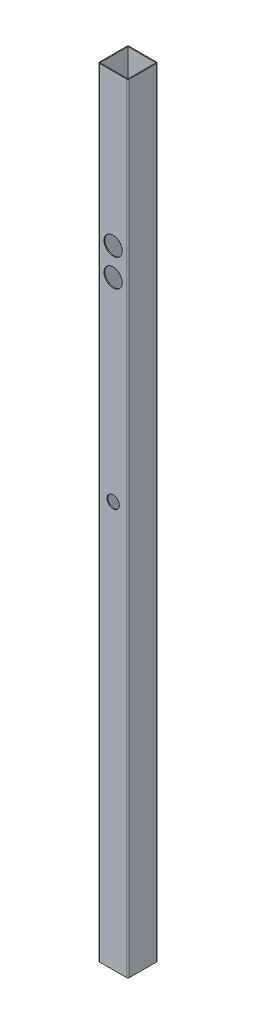
ISO-10303-21;
HEADER;
FILE_DESCRIPTION(('STEP AP214'),'2;1');
FILE_NAME('part.step','',(''),(''),'','','');
FILE_SCHEMA(('AUTOMOTIVE_DESIGN { 1 0 10303 214 1 1 1 1 }'));
ENDSEC;
DATA;
#1=APPLICATION_CONTEXT('core data for automotive mechanical design processes');
#2=APPLICATION_PROTOCOL_DEFINITION('international standard','automotive_design',2000,#1);
#3=PRODUCT_CONTEXT('',#1,'mechanical');
#4=PRODUCT('Part','Part','',(#3));
#5=PRODUCT_RELATED_PRODUCT_CATEGORY('part','',(#4));
#6=PRODUCT_DEFINITION_FORMATION('','',#4);
#7=PRODUCT_DEFINITION_CONTEXT('part definition',#1,'design');
#8=PRODUCT_DEFINITION('design','',#6,#7);
#9=PRODUCT_DEFINITION_SHAPE('','',#8);
#10=(LENGTH_UNIT() NAMED_UNIT(*) SI_UNIT(.MILLI.,.METRE.));
#11=(NAMED_UNIT(*) PLANE_ANGLE_UNIT() SI_UNIT($,.RADIAN.));
#12=(NAMED_UNIT(*) SI_UNIT($,.STERADIAN.) SOLID_ANGLE_UNIT());
#13=UNCERTAINTY_MEASURE_WITH_UNIT(LENGTH_MEASURE(1.E-05),#10,'distance_accuracy_value','');
#14=(GEOMETRIC_REPRESENTATION_CONTEXT(3) GLOBAL_UNCERTAINTY_ASSIGNED_CONTEXT((#13)) GLOBAL_UNIT_ASSIGNED_CONTEXT((#10,
#11,#12)) REPRESENTATION_CONTEXT('',''));
#15=CARTESIAN_POINT('',(0.,0.,0.));
#16=DIRECTION('',(0.,0.,1.));
#17=DIRECTION('',(1.,0.,0.));
#18=AXIS2_PLACEMENT_3D('',#15,#16,#17);
#19=CARTESIAN_POINT('',(0.,1700.,0.));
#20=DIRECTION('',(0.,1.,0.));
#21=DIRECTION('',(0.,0.,1.));
#22=AXIS2_PLACEMENT_3D('',#19,#20,#21);
#23=PLANE('',#22);
#24=DIRECTION('',(-1.,0.,0.));
#25=VECTOR('',#24,1.);
#26=CARTESIAN_POINT('',(-32.5,1700.,-32.5));
#27=LINE('',#26,#25);
#28=CARTESIAN_POINT('',(29.5,1700.,-32.5));
#29=VERTEX_POINT('',#28);
#30=CARTESIAN_POINT('',(-29.5,1700.,-32.5));
#31=VERTEX_POINT('',#30);
#32=EDGE_CURVE('E180',#29,#31,#27,.T.);
#33=ORIENTED_EDGE('',*,*,#32,.T.);
#34=CARTESIAN_POINT('',(-29.5,1700.,-29.5));
#35=DIRECTION('',(0.,1.,0.));
#36=DIRECTION('',(0.,0.,1.));
#37=AXIS2_PLACEMENT_3D('',#34,#35,#36);
#38=CIRCLE('',#37,3.);
#39=CARTESIAN_POINT('',(-32.5,1700.,-29.5));
#40=VERTEX_POINT('',#39);
#41=EDGE_CURVE('E222',#31,#40,#38,.T.);
#42=ORIENTED_EDGE('',*,*,#41,.T.);
#43=DIRECTION('',(0.,0.,1.));
#44=VECTOR('',#43,1.);
#45=CARTESIAN_POINT('',(-32.5,1700.,-32.5));
#46=LINE('',#45,#44);
#47=CARTESIAN_POINT('',(-32.5,1700.,29.5));
#48=VERTEX_POINT('',#47);
#49=EDGE_CURVE('E184',#40,#48,#46,.T.);
#50=ORIENTED_EDGE('',*,*,#49,.T.);
#51=CARTESIAN_POINT('',(-29.5,1700.,29.5));
#52=DIRECTION('',(0.,1.,0.));
#53=DIRECTION('',(0.,0.,1.));
#54=AXIS2_PLACEMENT_3D('',#51,#52,#53);
#55=CIRCLE('',#54,3.);
#56=CARTESIAN_POINT('',(-29.5,1700.,32.5));
#57=VERTEX_POINT('',#56);
#58=EDGE_CURVE('E63',#48,#57,#55,.T.);
#59=ORIENTED_EDGE('',*,*,#58,.T.);
#60=DIRECTION('',(1.,0.,0.));
#61=VECTOR('',#60,1.);
#62=CARTESIAN_POINT('',(-32.5,1700.,32.5));
#63=LINE('',#62,#61);
#64=CARTESIAN_POINT('',(29.5,1700.,32.5));
#65=VERTEX_POINT('',#64);
#66=EDGE_CURVE('E186',#57,#65,#63,.T.);
#67=ORIENTED_EDGE('',*,*,#66,.T.);
#68=CARTESIAN_POINT('',(29.5,1700.,29.5));
#69=DIRECTION('',(0.,1.,0.));
#70=DIRECTION('',(0.,0.,1.));
#71=AXIS2_PLACEMENT_3D('',#68,#69,#70);
#72=CIRCLE('',#71,3.);
#73=CARTESIAN_POINT('',(32.5,1700.,29.5));
#74=VERTEX_POINT('',#73);
#75=EDGE_CURVE('E219',#65,#74,#72,.T.);
#76=ORIENTED_EDGE('',*,*,#75,.T.);
#77=DIRECTION('',(0.,0.,-1.));
#78=VECTOR('',#77,1.);
#79=CARTESIAN_POINT('',(32.5,1700.,-32.5));
#80=LINE('',#79,#78);
#81=CARTESIAN_POINT('',(32.5,1700.,-29.5));
#82=VERTEX_POINT('',#81);
#83=EDGE_CURVE('E177',#74,#82,#80,.T.);
#84=ORIENTED_EDGE('',*,*,#83,.T.);
#85=CARTESIAN_POINT('',(29.5,1700.,-29.5));
#86=DIRECTION('',(0.,1.,0.));
#87=DIRECTION('',(0.,0.,1.));
#88=AXIS2_PLACEMENT_3D('',#85,#86,#87);
#89=CIRCLE('',#88,3.);
#90=EDGE_CURVE('E217',#82,#29,#89,.T.);
#91=ORIENTED_EDGE('',*,*,#90,.T.);
#92=EDGE_LOOP('',(#33,#42,#50,#59,#67,#76,#84,#91));
#93=FACE_BOUND('',#92,.T.);
#94=DIRECTION('',(1.,0.,0.));
#95=VECTOR('',#94,1.);
#96=CARTESIAN_POINT('',(-30.5,1700.,30.5));
#97=LINE('',#96,#95);
#98=CARTESIAN_POINT('',(-30.5,1700.,30.5));
#99=VERTEX_POINT('',#98);
#100=CARTESIAN_POINT('',(30.5,1700.,30.5));
#101=VERTEX_POINT('',#100);
#102=EDGE_CURVE('E143',#99,#101,#97,.T.);
#103=ORIENTED_EDGE('',*,*,#102,.F.);
#104=DIRECTION('',(0.,0.,1.));
#105=VECTOR('',#104,1.);
#106=CARTESIAN_POINT('',(-30.5,1700.,-30.5));
#107=LINE('',#106,#105);
#108=CARTESIAN_POINT('',(-30.5,1700.,-30.5));
#109=VERTEX_POINT('',#108);
#110=EDGE_CURVE('E133',#109,#99,#107,.T.);
#111=ORIENTED_EDGE('',*,*,#110,.F.);
#112=DIRECTION('',(-1.,0.,0.));
#113=VECTOR('',#112,1.);
#114=CARTESIAN_POINT('',(-30.5,1700.,-30.5));
#115=LINE('',#114,#113);
#116=CARTESIAN_POINT('',(30.5,1700.,-30.5));
#117=VERTEX_POINT('',#116);
#118=EDGE_CURVE('E158',#117,#109,#115,.T.);
#119=ORIENTED_EDGE('',*,*,#118,.F.);
#120=DIRECTION('',(0.,0.,-1.));
#121=VECTOR('',#120,1.);
#122=CARTESIAN_POINT('',(30.5,1700.,-30.5));
#123=LINE('',#122,#121);
#124=EDGE_CURVE('E156',#101,#117,#123,.T.);
#125=ORIENTED_EDGE('',*,*,#124,.F.);
#126=EDGE_LOOP('',(#103,#111,#119,#125));
#127=FACE_BOUND('',#126,.T.);
#128=ADVANCED_FACE('F39',(#93,#127),#23,.T.);
#129=CARTESIAN_POINT('',(0.,0.,0.));
#130=DIRECTION('',(0.,1.,0.));
#131=DIRECTION('',(0.,0.,1.));
#132=AXIS2_PLACEMENT_3D('',#129,#130,#131);
#133=PLANE('',#132);
#134=DIRECTION('',(0.,0.,1.));
#135=VECTOR('',#134,1.);
#136=CARTESIAN_POINT('',(-32.5,0.,-32.5));
#137=LINE('',#136,#135);
#138=CARTESIAN_POINT('',(-32.5,0.,-29.5));
#139=VERTEX_POINT('',#138);
#140=CARTESIAN_POINT('',(-32.5,0.,29.5));
#141=VERTEX_POINT('',#140);
#142=EDGE_CURVE('E194',#139,#141,#137,.T.);
#143=ORIENTED_EDGE('',*,*,#142,.F.);
#144=CARTESIAN_POINT('',(-29.5,0.,-29.5));
#145=DIRECTION('',(0.,1.,0.));
#146=DIRECTION('',(0.,0.,1.));
#147=AXIS2_PLACEMENT_3D('',#144,#145,#146);
#148=CIRCLE('',#147,3.);
#149=CARTESIAN_POINT('',(-29.5,0.,-32.5));
#150=VERTEX_POINT('',#149);
#151=EDGE_CURVE('E209',#139,#150,#148,.F.);
#152=ORIENTED_EDGE('',*,*,#151,.T.);
#153=DIRECTION('',(-1.,0.,0.));
#154=VECTOR('',#153,1.);
#155=CARTESIAN_POINT('',(-32.5,0.,-32.5));
#156=LINE('',#155,#154);
#157=CARTESIAN_POINT('',(29.5,0.,-32.5));
#158=VERTEX_POINT('',#157);
#159=EDGE_CURVE('E191',#158,#150,#156,.T.);
#160=ORIENTED_EDGE('',*,*,#159,.F.);
#161=CARTESIAN_POINT('',(29.5,0.,-29.5));
#162=DIRECTION('',(0.,1.,0.));
#163=DIRECTION('',(0.,0.,1.));
#164=AXIS2_PLACEMENT_3D('',#161,#162,#163);
#165=CIRCLE('',#164,3.);
#166=CARTESIAN_POINT('',(32.5,0.,-29.5));
#167=VERTEX_POINT('',#166);
#168=EDGE_CURVE('E203',#158,#167,#165,.F.);
#169=ORIENTED_EDGE('',*,*,#168,.T.);
#170=DIRECTION('',(0.,0.,-1.));
#171=VECTOR('',#170,1.);
#172=CARTESIAN_POINT('',(32.5,0.,-32.5));
#173=LINE('',#172,#171);
#174=CARTESIAN_POINT('',(32.5,0.,29.5));
#175=VERTEX_POINT('',#174);
#176=EDGE_CURVE('E151',#175,#167,#173,.T.);
#177=ORIENTED_EDGE('',*,*,#176,.F.);
#178=CARTESIAN_POINT('',(29.5,0.,29.5));
#179=DIRECTION('',(0.,1.,0.));
#180=DIRECTION('',(0.,0.,1.));
#181=AXIS2_PLACEMENT_3D('',#178,#179,#180);
#182=CIRCLE('',#181,3.);
#183=CARTESIAN_POINT('',(29.5,0.,32.5));
#184=VERTEX_POINT('',#183);
#185=EDGE_CURVE('E205',#175,#184,#182,.F.);
#186=ORIENTED_EDGE('',*,*,#185,.T.);
#187=DIRECTION('',(1.,0.,0.));
#188=VECTOR('',#187,1.);
#189=CARTESIAN_POINT('',(-32.5,0.,32.5));
#190=LINE('',#189,#188);
#191=CARTESIAN_POINT('',(-29.5,0.,32.5));
#192=VERTEX_POINT('',#191);
#193=EDGE_CURVE('E181',#192,#184,#190,.T.);
#194=ORIENTED_EDGE('',*,*,#193,.F.);
#195=CARTESIAN_POINT('',(-29.5,0.,29.5));
#196=DIRECTION('',(0.,1.,0.));
#197=DIRECTION('',(0.,0.,1.));
#198=AXIS2_PLACEMENT_3D('',#195,#196,#197);
#199=CIRCLE('',#198,3.);
#200=EDGE_CURVE('E207',#192,#141,#199,.F.);
#201=ORIENTED_EDGE('',*,*,#200,.T.);
#202=EDGE_LOOP('',(#143,#152,#160,#169,#177,#186,#194,#201));
#203=FACE_BOUND('',#202,.T.);
#204=DIRECTION('',(0.,0.,1.));
#205=VECTOR('',#204,1.);
#206=CARTESIAN_POINT('',(-30.5,0.,-30.5));
#207=LINE('',#206,#205);
#208=CARTESIAN_POINT('',(-30.5,0.,-30.5));
#209=VERTEX_POINT('',#208);
#210=CARTESIAN_POINT('',(-30.5,0.,30.5));
#211=VERTEX_POINT('',#210);
#212=EDGE_CURVE('E163',#209,#211,#207,.T.);
#213=ORIENTED_EDGE('',*,*,#212,.T.);
#214=DIRECTION('',(1.,0.,0.));
#215=VECTOR('',#214,1.);
#216=CARTESIAN_POINT('',(-30.5,0.,30.5));
#217=LINE('',#216,#215);
#218=CARTESIAN_POINT('',(30.5,0.,30.5));
#219=VERTEX_POINT('',#218);
#220=EDGE_CURVE('E150',#211,#219,#217,.T.);
#221=ORIENTED_EDGE('',*,*,#220,.T.);
#222=DIRECTION('',(0.,0.,-1.));
#223=VECTOR('',#222,1.);
#224=CARTESIAN_POINT('',(30.5,0.,-30.5));
#225=LINE('',#224,#223);
#226=CARTESIAN_POINT('',(30.5,0.,-30.5));
#227=VERTEX_POINT('',#226);
#228=EDGE_CURVE('E167',#219,#227,#225,.T.);
#229=ORIENTED_EDGE('',*,*,#228,.T.);
#230=DIRECTION('',(-1.,0.,0.));
#231=VECTOR('',#230,1.);
#232=CARTESIAN_POINT('',(-30.5,0.,-30.5));
#233=LINE('',#232,#231);
#234=EDGE_CURVE('E144',#227,#209,#233,.T.);
#235=ORIENTED_EDGE('',*,*,#234,.T.);
#236=EDGE_LOOP('',(#213,#221,#229,#235));
#237=FACE_BOUND('',#236,.T.);
#238=ADVANCED_FACE('F246',(#203,#237),#133,.F.);
#239=CARTESIAN_POINT('',(32.5,1700.,-32.5));
#240=DIRECTION('',(-1.,0.,0.));
#241=DIRECTION('',(0.,0.,1.));
#242=AXIS2_PLACEMENT_3D('',#239,#240,#241);
#243=PLANE('',#242);
#244=ORIENTED_EDGE('',*,*,#83,.F.);
#245=DIRECTION('',(0.,-1.,0.));
#246=VECTOR('',#245,1.);
#247=CARTESIAN_POINT('',(32.5,1700.,29.5));
#248=LINE('',#247,#246);
#249=EDGE_CURVE('E11',#74,#175,#248,.T.);
#250=ORIENTED_EDGE('',*,*,#249,.T.);
#251=ORIENTED_EDGE('',*,*,#176,.T.);
#252=DIRECTION('',(0.,-1.,0.));
#253=VECTOR('',#252,1.);
#254=CARTESIAN_POINT('',(32.5,1700.,-29.5));
#255=LINE('',#254,#253);
#256=EDGE_CURVE('E49',#167,#82,#255,.F.);
#257=ORIENTED_EDGE('',*,*,#256,.T.);
#258=EDGE_LOOP('',(#244,#250,#251,#257));
#259=FACE_BOUND('',#258,.T.);
#260=ADVANCED_FACE('F232',(#259),#243,.F.);
#261=CARTESIAN_POINT('',(-32.5,1700.,-32.5));
#262=DIRECTION('',(0.,0.,1.));
#263=DIRECTION('',(1.,0.,0.));
#264=AXIS2_PLACEMENT_3D('',#261,#262,#263);
#265=PLANE('',#264);
#266=CARTESIAN_POINT('',(0.,885.5,-32.5));
#267=DIRECTION('',(0.,0.,-1.));
#268=DIRECTION('',(-1.,0.,0.));
#269=AXIS2_PLACEMENT_3D('',#266,#267,#268);
#270=CIRCLE('',#269,13.5);
#271=CARTESIAN_POINT('',(-13.5,885.5,-32.5));
#272=VERTEX_POINT('',#271);
#273=EDGE_CURVE('E437',#272,#272,#270,.T.);
#274=ORIENTED_EDGE('',*,*,#273,.F.);
#275=EDGE_LOOP('',(#274));
#276=FACE_BOUND('',#275,.T.);
#277=CARTESIAN_POINT('',(-20.0000000000001,1280.,-32.5));
#278=DIRECTION('',(0.,0.,-1.));
#279=DIRECTION('',(1.,0.,0.));
#280=AXIS2_PLACEMENT_3D('',#277,#278,#279);
#281=CIRCLE('',#280,3.);
#282=CARTESIAN_POINT('',(-17.0000000000001,1280.,-32.5));
#283=VERTEX_POINT('',#282);
#284=EDGE_CURVE('E360',#283,#283,#281,.T.);
#285=ORIENTED_EDGE('',*,*,#284,.F.);
#286=EDGE_LOOP('',(#285));
#287=FACE_BOUND('',#286,.T.);
#288=CARTESIAN_POINT('',(0.,300.,-32.5));
#289=DIRECTION('',(0.,0.,-1.));
#290=DIRECTION('',(-1.,0.,0.));
#291=AXIS2_PLACEMENT_3D('',#288,#289,#290);
#292=CIRCLE('',#291,27.5);
#293=CARTESIAN_POINT('',(-27.5,300.,-32.5));
#294=VERTEX_POINT('',#293);
#295=EDGE_CURVE('E366',#294,#294,#292,.T.);
#296=ORIENTED_EDGE('',*,*,#295,.F.);
#297=EDGE_LOOP('',(#296));
#298=FACE_BOUND('',#297,.T.);
#299=CARTESIAN_POINT('',(19.9999999999999,1280.,-32.5));
#300=DIRECTION('',(0.,0.,-1.));
#301=DIRECTION('',(1.,0.,0.));
#302=AXIS2_PLACEMENT_3D('',#299,#300,#301);
#303=CIRCLE('',#302,3.);
#304=CARTESIAN_POINT('',(22.9999999999999,1280.,-32.5));
#305=VERTEX_POINT('',#304);
#306=EDGE_CURVE('E372',#305,#305,#303,.T.);
#307=ORIENTED_EDGE('',*,*,#306,.F.);
#308=EDGE_LOOP('',(#307));
#309=FACE_BOUND('',#308,.T.);
#310=CARTESIAN_POINT('',(19.9999999999999,1340.,-32.5));
#311=DIRECTION('',(0.,0.,-1.));
#312=DIRECTION('',(-1.,0.,0.));
#313=AXIS2_PLACEMENT_3D('',#310,#311,#312);
#314=CIRCLE('',#313,3.);
#315=CARTESIAN_POINT('',(16.9999999999999,1340.,-32.5));
#316=VERTEX_POINT('',#315);
#317=EDGE_CURVE('E378',#316,#316,#314,.T.);
#318=ORIENTED_EDGE('',*,*,#317,.F.);
#319=EDGE_LOOP('',(#318));
#320=FACE_BOUND('',#319,.T.);
#321=CARTESIAN_POINT('',(-20.0000000000001,1340.,-32.5));
#322=DIRECTION('',(0.,0.,-1.));
#323=DIRECTION('',(-1.,0.,0.));
#324=AXIS2_PLACEMENT_3D('',#321,#322,#323);
#325=CIRCLE('',#324,3.);
#326=CARTESIAN_POINT('',(-23.0000000000001,1340.,-32.5));
#327=VERTEX_POINT('',#326);
#328=EDGE_CURVE('E384',#327,#327,#325,.T.);
#329=ORIENTED_EDGE('',*,*,#328,.F.);
#330=EDGE_LOOP('',(#329));
#331=FACE_BOUND('',#330,.T.);
#332=CARTESIAN_POINT('',(19.9999999999999,1400.,-32.5));
#333=DIRECTION('',(0.,0.,-1.));
#334=DIRECTION('',(-1.,0.,0.));
#335=AXIS2_PLACEMENT_3D('',#332,#333,#334);
#336=CIRCLE('',#335,3.);
#337=CARTESIAN_POINT('',(16.9999999999999,1400.,-32.5));
#338=VERTEX_POINT('',#337);
#339=EDGE_CURVE('E390',#338,#338,#336,.T.);
#340=ORIENTED_EDGE('',*,*,#339,.F.);
#341=EDGE_LOOP('',(#340));
#342=FACE_BOUND('',#341,.T.);
#343=CARTESIAN_POINT('',(-20.0000000000001,1400.,-32.5));
#344=DIRECTION('',(0.,0.,-1.));
#345=DIRECTION('',(-1.,0.,0.));
#346=AXIS2_PLACEMENT_3D('',#343,#344,#345);
#347=CIRCLE('',#346,3.);
#348=CARTESIAN_POINT('',(-23.0000000000001,1400.,-32.5));
#349=VERTEX_POINT('',#348);
#350=EDGE_CURVE('E165',#349,#349,#347,.T.);
#351=ORIENTED_EDGE('',*,*,#350,.F.);
#352=EDGE_LOOP('',(#351));
#353=FACE_BOUND('',#352,.T.);
#354=ORIENTED_EDGE('',*,*,#159,.T.);
#355=DIRECTION('',(0.,-1.,0.));
#356=VECTOR('',#355,1.);
#357=CARTESIAN_POINT('',(-29.5,1700.,-32.5));
#358=LINE('',#357,#356);
#359=EDGE_CURVE('E215',#150,#31,#358,.F.);
#360=ORIENTED_EDGE('',*,*,#359,.T.);
#361=ORIENTED_EDGE('',*,*,#32,.F.);
#362=DIRECTION('',(0.,-1.,0.));
#363=VECTOR('',#362,1.);
#364=CARTESIAN_POINT('',(29.5,1700.,-32.5));
#365=LINE('',#364,#363);
#366=EDGE_CURVE('E211',#29,#158,#365,.T.);
#367=ORIENTED_EDGE('',*,*,#366,.T.);
#368=EDGE_LOOP('',(#354,#360,#361,#367));
#369=FACE_BOUND('',#368,.T.);
#370=ADVANCED_FACE('F242',(#276,#287,#298,#309,#320,#331,#342,#353,#369),#265,.F.);
#371=CARTESIAN_POINT('',(-32.5,1700.,-32.5));
#372=DIRECTION('',(1.,0.,0.));
#373=DIRECTION('',(0.,0.,-1.));
#374=AXIS2_PLACEMENT_3D('',#371,#372,#373);
#375=PLANE('',#374);
#376=ORIENTED_EDGE('',*,*,#49,.F.);
#377=DIRECTION('',(0.,-1.,0.));
#378=VECTOR('',#377,1.);
#379=CARTESIAN_POINT('',(-32.5,1700.,-29.5));
#380=LINE('',#379,#378);
#381=EDGE_CURVE('E200',#40,#139,#380,.T.);
#382=ORIENTED_EDGE('',*,*,#381,.T.);
#383=ORIENTED_EDGE('',*,*,#142,.T.);
#384=DIRECTION('',(0.,-1.,0.));
#385=VECTOR('',#384,1.);
#386=CARTESIAN_POINT('',(-32.5,1700.,29.5));
#387=LINE('',#386,#385);
#388=EDGE_CURVE('E188',#141,#48,#387,.F.);
#389=ORIENTED_EDGE('',*,*,#388,.T.);
#390=EDGE_LOOP('',(#376,#382,#383,#389));
#391=FACE_BOUND('',#390,.T.);
#392=ADVANCED_FACE('F254',(#391),#375,.F.);
#393=CARTESIAN_POINT('',(-32.5,1700.,32.5));
#394=DIRECTION('',(0.,0.,-1.));
#395=DIRECTION('',(-1.,0.,0.));
#396=AXIS2_PLACEMENT_3D('',#393,#394,#395);
#397=PLANE('',#396);
#398=CARTESIAN_POINT('',(0.,885.5,32.5));
#399=DIRECTION('',(0.,0.,-1.));
#400=DIRECTION('',(-1.,0.,0.));
#401=AXIS2_PLACEMENT_3D('',#398,#399,#400);
#402=CIRCLE('',#401,13.5);
#403=CARTESIAN_POINT('',(-13.5,885.5,32.5));
#404=VERTEX_POINT('',#403);
#405=EDGE_CURVE('E441',#404,#404,#402,.T.);
#406=ORIENTED_EDGE('',*,*,#405,.T.);
#407=EDGE_LOOP('',(#406));
#408=FACE_BOUND('',#407,.T.);
#409=CARTESIAN_POINT('',(0.,1310.,32.5));
#410=DIRECTION('',(0.,0.,1.));
#411=DIRECTION('',(1.,0.,0.));
#412=AXIS2_PLACEMENT_3D('',#409,#410,#411);
#413=CIRCLE('',#412,20.);
#414=CARTESIAN_POINT('',(19.9999999999999,1310.,32.5));
#415=VERTEX_POINT('',#414);
#416=EDGE_CURVE('E351',#415,#415,#413,.T.);
#417=ORIENTED_EDGE('',*,*,#416,.F.);
#418=EDGE_LOOP('',(#417));
#419=FACE_BOUND('',#418,.T.);
#420=CARTESIAN_POINT('',(0.,1370.,32.5));
#421=DIRECTION('',(0.,0.,1.));
#422=DIRECTION('',(1.,0.,0.));
#423=AXIS2_PLACEMENT_3D('',#420,#421,#422);
#424=CIRCLE('',#423,20.);
#425=CARTESIAN_POINT('',(19.9999999999999,1370.,32.5));
#426=VERTEX_POINT('',#425);
#427=EDGE_CURVE('E350',#426,#426,#424,.T.);
#428=ORIENTED_EDGE('',*,*,#427,.F.);
#429=EDGE_LOOP('',(#428));
#430=FACE_BOUND('',#429,.T.);
#431=ORIENTED_EDGE('',*,*,#66,.F.);
#432=DIRECTION('',(0.,-1.,0.));
#433=VECTOR('',#432,1.);
#434=CARTESIAN_POINT('',(-29.5,1700.,32.5));
#435=LINE('',#434,#433);
#436=EDGE_CURVE('E226',#57,#192,#435,.T.);
#437=ORIENTED_EDGE('',*,*,#436,.T.);
#438=ORIENTED_EDGE('',*,*,#193,.T.);
#439=DIRECTION('',(0.,-1.,0.));
#440=VECTOR('',#439,1.);
#441=CARTESIAN_POINT('',(29.5,1700.,32.5));
#442=LINE('',#441,#440);
#443=EDGE_CURVE('E56',#184,#65,#442,.F.);
#444=ORIENTED_EDGE('',*,*,#443,.T.);
#445=EDGE_LOOP('',(#431,#437,#438,#444));
#446=FACE_BOUND('',#445,.T.);
#447=ADVANCED_FACE('F260',(#408,#419,#430,#446),#397,.F.);
#448=CARTESIAN_POINT('',(-30.5,1700.,-30.5));
#449=DIRECTION('',(1.,0.,0.));
#450=DIRECTION('',(0.,0.,-1.));
#451=AXIS2_PLACEMENT_3D('',#448,#449,#450);
#452=PLANE('',#451);
#453=ORIENTED_EDGE('',*,*,#212,.F.);
#454=DIRECTION('',(0.,-1.,0.));
#455=VECTOR('',#454,1.);
#456=CARTESIAN_POINT('',(-30.5,1700.,-30.5));
#457=LINE('',#456,#455);
#458=EDGE_CURVE('E139',#109,#209,#457,.T.);
#459=ORIENTED_EDGE('',*,*,#458,.F.);
#460=ORIENTED_EDGE('',*,*,#110,.T.);
#461=DIRECTION('',(0.,-1.,0.));
#462=VECTOR('',#461,1.);
#463=CARTESIAN_POINT('',(-30.5,1700.,30.5));
#464=LINE('',#463,#462);
#465=EDGE_CURVE('E136',#99,#211,#464,.T.);
#466=ORIENTED_EDGE('',*,*,#465,.T.);
#467=EDGE_LOOP('',(#453,#459,#460,#466));
#468=FACE_BOUND('',#467,.T.);
#469=ADVANCED_FACE('F135',(#468),#452,.T.);
#470=CARTESIAN_POINT('',(-30.5,1700.,30.5));
#471=DIRECTION('',(0.,0.,-1.));
#472=DIRECTION('',(-1.,0.,0.));
#473=AXIS2_PLACEMENT_3D('',#470,#471,#472);
#474=PLANE('',#473);
#475=CARTESIAN_POINT('',(0.,885.5,30.5));
#476=DIRECTION('',(0.,0.,-1.));
#477=DIRECTION('',(-1.,0.,0.));
#478=AXIS2_PLACEMENT_3D('',#475,#476,#477);
#479=CIRCLE('',#478,13.5);
#480=CARTESIAN_POINT('',(-13.5,885.5,30.5));
#481=VERTEX_POINT('',#480);
#482=EDGE_CURVE('E341',#481,#481,#479,.T.);
#483=ORIENTED_EDGE('',*,*,#482,.F.);
#484=EDGE_LOOP('',(#483));
#485=FACE_BOUND('',#484,.T.);
#486=CARTESIAN_POINT('',(0.,1310.,30.5));
#487=DIRECTION('',(0.,0.,-1.));
#488=DIRECTION('',(-1.,0.,0.));
#489=AXIS2_PLACEMENT_3D('',#486,#487,#488);
#490=CIRCLE('',#489,20.);
#491=CARTESIAN_POINT('',(-20.0000000000001,1310.,30.5));
#492=VERTEX_POINT('',#491);
#493=EDGE_CURVE('E345',#492,#492,#490,.F.);
#494=ORIENTED_EDGE('',*,*,#493,.T.);
#495=EDGE_LOOP('',(#494));
#496=FACE_BOUND('',#495,.T.);
#497=CARTESIAN_POINT('',(0.,1370.,30.5));
#498=DIRECTION('',(0.,0.,-1.));
#499=DIRECTION('',(-1.,0.,0.));
#500=AXIS2_PLACEMENT_3D('',#497,#498,#499);
#501=CIRCLE('',#500,20.);
#502=CARTESIAN_POINT('',(-20.0000000000001,1370.,30.5));
#503=VERTEX_POINT('',#502);
#504=EDGE_CURVE('E348',#503,#503,#501,.F.);
#505=ORIENTED_EDGE('',*,*,#504,.T.);
#506=EDGE_LOOP('',(#505));
#507=FACE_BOUND('',#506,.T.);
#508=ORIENTED_EDGE('',*,*,#220,.F.);
#509=ORIENTED_EDGE('',*,*,#465,.F.);
#510=ORIENTED_EDGE('',*,*,#102,.T.);
#511=DIRECTION('',(0.,-1.,0.));
#512=VECTOR('',#511,1.);
#513=CARTESIAN_POINT('',(30.5,1700.,30.5));
#514=LINE('',#513,#512);
#515=EDGE_CURVE('E152',#101,#219,#514,.T.);
#516=ORIENTED_EDGE('',*,*,#515,.T.);
#517=EDGE_LOOP('',(#508,#509,#510,#516));
#518=FACE_BOUND('',#517,.T.);
#519=ADVANCED_FACE('F147',(#485,#496,#507,#518),#474,.T.);
#520=CARTESIAN_POINT('',(30.5,1700.,-30.5));
#521=DIRECTION('',(-1.,0.,0.));
#522=DIRECTION('',(0.,0.,1.));
#523=AXIS2_PLACEMENT_3D('',#520,#521,#522);
#524=PLANE('',#523);
#525=ORIENTED_EDGE('',*,*,#228,.F.);
#526=ORIENTED_EDGE('',*,*,#515,.F.);
#527=ORIENTED_EDGE('',*,*,#124,.T.);
#528=DIRECTION('',(0.,-1.,0.));
#529=VECTOR('',#528,1.);
#530=CARTESIAN_POINT('',(30.5,1700.,-30.5));
#531=LINE('',#530,#529);
#532=EDGE_CURVE('E173',#117,#227,#531,.T.);
#533=ORIENTED_EDGE('',*,*,#532,.T.);
#534=EDGE_LOOP('',(#525,#526,#527,#533));
#535=FACE_BOUND('',#534,.T.);
#536=ADVANCED_FACE('F330',(#535),#524,.T.);
#537=CARTESIAN_POINT('',(-30.5,1700.,-30.5));
#538=DIRECTION('',(0.,0.,1.));
#539=DIRECTION('',(1.,0.,0.));
#540=AXIS2_PLACEMENT_3D('',#537,#538,#539);
#541=PLANE('',#540);
#542=CARTESIAN_POINT('',(0.,885.5,-30.5));
#543=DIRECTION('',(0.,0.,1.));
#544=DIRECTION('',(1.,0.,0.));
#545=AXIS2_PLACEMENT_3D('',#542,#543,#544);
#546=CIRCLE('',#545,13.5);
#547=CARTESIAN_POINT('',(13.5,885.5,-30.5));
#548=VERTEX_POINT('',#547);
#549=EDGE_CURVE('E43',#548,#548,#546,.T.);
#550=ORIENTED_EDGE('',*,*,#549,.F.);
#551=EDGE_LOOP('',(#550));
#552=FACE_BOUND('',#551,.T.);
#553=CARTESIAN_POINT('',(-20.0000000000001,1280.,-30.5));
#554=DIRECTION('',(0.,0.,1.));
#555=DIRECTION('',(1.,0.,0.));
#556=AXIS2_PLACEMENT_3D('',#553,#554,#555);
#557=CIRCLE('',#556,3.);
#558=CARTESIAN_POINT('',(-17.0000000000001,1280.,-30.5));
#559=VERTEX_POINT('',#558);
#560=EDGE_CURVE('E354',#559,#559,#557,.F.);
#561=ORIENTED_EDGE('',*,*,#560,.T.);
#562=EDGE_LOOP('',(#561));
#563=FACE_BOUND('',#562,.T.);
#564=CARTESIAN_POINT('',(0.,300.,-30.5));
#565=DIRECTION('',(0.,0.,1.));
#566=DIRECTION('',(1.,0.,0.));
#567=AXIS2_PLACEMENT_3D('',#564,#565,#566);
#568=CIRCLE('',#567,27.5);
#569=CARTESIAN_POINT('',(27.5,300.,-30.5));
#570=VERTEX_POINT('',#569);
#571=EDGE_CURVE('E363',#570,#570,#568,.F.);
#572=ORIENTED_EDGE('',*,*,#571,.T.);
#573=EDGE_LOOP('',(#572));
#574=FACE_BOUND('',#573,.T.);
#575=CARTESIAN_POINT('',(19.9999999999999,1280.,-30.5));
#576=DIRECTION('',(0.,0.,1.));
#577=DIRECTION('',(1.,0.,0.));
#578=AXIS2_PLACEMENT_3D('',#575,#576,#577);
#579=CIRCLE('',#578,3.);
#580=CARTESIAN_POINT('',(22.9999999999999,1280.,-30.5));
#581=VERTEX_POINT('',#580);
#582=EDGE_CURVE('E369',#581,#581,#579,.F.);
#583=ORIENTED_EDGE('',*,*,#582,.T.);
#584=EDGE_LOOP('',(#583));
#585=FACE_BOUND('',#584,.T.);
#586=CARTESIAN_POINT('',(19.9999999999999,1340.,-30.5));
#587=DIRECTION('',(0.,0.,1.));
#588=DIRECTION('',(1.,0.,0.));
#589=AXIS2_PLACEMENT_3D('',#586,#587,#588);
#590=CIRCLE('',#589,3.);
#591=CARTESIAN_POINT('',(22.9999999999999,1340.,-30.5));
#592=VERTEX_POINT('',#591);
#593=EDGE_CURVE('E375',#592,#592,#590,.F.);
#594=ORIENTED_EDGE('',*,*,#593,.T.);
#595=EDGE_LOOP('',(#594));
#596=FACE_BOUND('',#595,.T.);
#597=CARTESIAN_POINT('',(-20.0000000000001,1340.,-30.5));
#598=DIRECTION('',(0.,0.,1.));
#599=DIRECTION('',(1.,0.,0.));
#600=AXIS2_PLACEMENT_3D('',#597,#598,#599);
#601=CIRCLE('',#600,3.);
#602=CARTESIAN_POINT('',(-17.0000000000001,1340.,-30.5));
#603=VERTEX_POINT('',#602);
#604=EDGE_CURVE('E381',#603,#603,#601,.F.);
#605=ORIENTED_EDGE('',*,*,#604,.T.);
#606=EDGE_LOOP('',(#605));
#607=FACE_BOUND('',#606,.T.);
#608=CARTESIAN_POINT('',(19.9999999999999,1400.,-30.5));
#609=DIRECTION('',(0.,0.,1.));
#610=DIRECTION('',(1.,0.,0.));
#611=AXIS2_PLACEMENT_3D('',#608,#609,#610);
#612=CIRCLE('',#611,3.);
#613=CARTESIAN_POINT('',(22.9999999999999,1400.,-30.5));
#614=VERTEX_POINT('',#613);
#615=EDGE_CURVE('E387',#614,#614,#612,.F.);
#616=ORIENTED_EDGE('',*,*,#615,.T.);
#617=EDGE_LOOP('',(#616));
#618=FACE_BOUND('',#617,.T.);
#619=CARTESIAN_POINT('',(-20.0000000000001,1400.,-30.5));
#620=DIRECTION('',(0.,0.,1.));
#621=DIRECTION('',(1.,0.,0.));
#622=AXIS2_PLACEMENT_3D('',#619,#620,#621);
#623=CIRCLE('',#622,3.);
#624=CARTESIAN_POINT('',(-17.0000000000001,1400.,-30.5));
#625=VERTEX_POINT('',#624);
#626=EDGE_CURVE('E393',#625,#625,#623,.F.);
#627=ORIENTED_EDGE('',*,*,#626,.T.);
#628=EDGE_LOOP('',(#627));
#629=FACE_BOUND('',#628,.T.);
#630=ORIENTED_EDGE('',*,*,#234,.F.);
#631=ORIENTED_EDGE('',*,*,#532,.F.);
#632=ORIENTED_EDGE('',*,*,#118,.T.);
#633=ORIENTED_EDGE('',*,*,#458,.T.);
#634=EDGE_LOOP('',(#630,#631,#632,#633));
#635=FACE_BOUND('',#634,.T.);
#636=ADVANCED_FACE('F326',(#552,#563,#574,#585,#596,#607,#618,#629,#635),#541,.T.);
#637=CARTESIAN_POINT('',(-20.0000000000001,1400.,32.501));
#638=DIRECTION('',(0.,0.,-1.));
#639=DIRECTION('',(-1.,0.,0.));
#640=AXIS2_PLACEMENT_3D('',#637,#638,#639);
#641=CYLINDRICAL_SURFACE('',#640,3.);
#642=ORIENTED_EDGE('',*,*,#626,.F.);
#643=EDGE_LOOP('',(#642));
#644=FACE_BOUND('',#643,.T.);
#645=ORIENTED_EDGE('',*,*,#350,.T.);
#646=EDGE_LOOP('',(#645));
#647=FACE_BOUND('',#646,.T.);
#648=ADVANCED_FACE('F322',(#644,#647),#641,.F.);
#649=CARTESIAN_POINT('',(19.9999999999999,1400.,32.501));
#650=DIRECTION('',(0.,0.,-1.));
#651=DIRECTION('',(-1.,0.,0.));
#652=AXIS2_PLACEMENT_3D('',#649,#650,#651);
#653=CYLINDRICAL_SURFACE('',#652,3.);
#654=ORIENTED_EDGE('',*,*,#615,.F.);
#655=EDGE_LOOP('',(#654));
#656=FACE_BOUND('',#655,.T.);
#657=ORIENTED_EDGE('',*,*,#339,.T.);
#658=EDGE_LOOP('',(#657));
#659=FACE_BOUND('',#658,.T.);
#660=ADVANCED_FACE('F318',(#656,#659),#653,.F.);
#661=CARTESIAN_POINT('',(-20.0000000000001,1340.,32.501));
#662=DIRECTION('',(0.,0.,-1.));
#663=DIRECTION('',(-1.,0.,0.));
#664=AXIS2_PLACEMENT_3D('',#661,#662,#663);
#665=CYLINDRICAL_SURFACE('',#664,3.);
#666=ORIENTED_EDGE('',*,*,#604,.F.);
#667=EDGE_LOOP('',(#666));
#668=FACE_BOUND('',#667,.T.);
#669=ORIENTED_EDGE('',*,*,#328,.T.);
#670=EDGE_LOOP('',(#669));
#671=FACE_BOUND('',#670,.T.);
#672=ADVANCED_FACE('F314',(#668,#671),#665,.F.);
#673=CARTESIAN_POINT('',(19.9999999999999,1340.,32.501));
#674=DIRECTION('',(0.,0.,-1.));
#675=DIRECTION('',(-1.,0.,0.));
#676=AXIS2_PLACEMENT_3D('',#673,#674,#675);
#677=CYLINDRICAL_SURFACE('',#676,3.);
#678=ORIENTED_EDGE('',*,*,#593,.F.);
#679=EDGE_LOOP('',(#678));
#680=FACE_BOUND('',#679,.T.);
#681=ORIENTED_EDGE('',*,*,#317,.T.);
#682=EDGE_LOOP('',(#681));
#683=FACE_BOUND('',#682,.T.);
#684=ADVANCED_FACE('F310',(#680,#683),#677,.F.);
#685=CARTESIAN_POINT('',(19.9999999999999,1280.,32.501));
#686=DIRECTION('',(0.,0.,-1.));
#687=DIRECTION('',(-1.,0.,0.));
#688=AXIS2_PLACEMENT_3D('',#685,#686,#687);
#689=CYLINDRICAL_SURFACE('',#688,3.);
#690=ORIENTED_EDGE('',*,*,#582,.F.);
#691=EDGE_LOOP('',(#690));
#692=FACE_BOUND('',#691,.T.);
#693=ORIENTED_EDGE('',*,*,#306,.T.);
#694=EDGE_LOOP('',(#693));
#695=FACE_BOUND('',#694,.T.);
#696=ADVANCED_FACE('F300',(#692,#695),#689,.F.);
#697=CARTESIAN_POINT('',(0.,300.,32.501));
#698=DIRECTION('',(0.,0.,-1.));
#699=DIRECTION('',(-1.,0.,0.));
#700=AXIS2_PLACEMENT_3D('',#697,#698,#699);
#701=CYLINDRICAL_SURFACE('',#700,27.5);
#702=ORIENTED_EDGE('',*,*,#571,.F.);
#703=EDGE_LOOP('',(#702));
#704=FACE_BOUND('',#703,.T.);
#705=ORIENTED_EDGE('',*,*,#295,.T.);
#706=EDGE_LOOP('',(#705));
#707=FACE_BOUND('',#706,.T.);
#708=ADVANCED_FACE('F294',(#704,#707),#701,.F.);
#709=CARTESIAN_POINT('',(-20.0000000000001,1280.,32.501));
#710=DIRECTION('',(0.,0.,-1.));
#711=DIRECTION('',(-1.,0.,0.));
#712=AXIS2_PLACEMENT_3D('',#709,#710,#711);
#713=CYLINDRICAL_SURFACE('',#712,3.);
#714=ORIENTED_EDGE('',*,*,#560,.F.);
#715=EDGE_LOOP('',(#714));
#716=FACE_BOUND('',#715,.T.);
#717=ORIENTED_EDGE('',*,*,#284,.T.);
#718=EDGE_LOOP('',(#717));
#719=FACE_BOUND('',#718,.T.);
#720=ADVANCED_FACE('F290',(#716,#719),#713,.F.);
#721=CARTESIAN_POINT('',(-29.5,1700.,-29.5));
#722=DIRECTION('',(0.,-1.,0.));
#723=DIRECTION('',(0.,0.,-1.));
#724=AXIS2_PLACEMENT_3D('',#721,#722,#723);
#725=CYLINDRICAL_SURFACE('',#724,3.);
#726=ORIENTED_EDGE('',*,*,#41,.F.);
#727=ORIENTED_EDGE('',*,*,#359,.F.);
#728=ORIENTED_EDGE('',*,*,#151,.F.);
#729=ORIENTED_EDGE('',*,*,#381,.F.);
#730=EDGE_LOOP('',(#726,#727,#728,#729));
#731=FACE_BOUND('',#730,.T.);
#732=ADVANCED_FACE('F251',(#731),#725,.T.);
#733=CARTESIAN_POINT('',(-29.5,1700.,29.5));
#734=DIRECTION('',(0.,-1.,0.));
#735=DIRECTION('',(0.,0.,-1.));
#736=AXIS2_PLACEMENT_3D('',#733,#734,#735);
#737=CYLINDRICAL_SURFACE('',#736,3.);
#738=ORIENTED_EDGE('',*,*,#58,.F.);
#739=ORIENTED_EDGE('',*,*,#388,.F.);
#740=ORIENTED_EDGE('',*,*,#200,.F.);
#741=ORIENTED_EDGE('',*,*,#436,.F.);
#742=EDGE_LOOP('',(#738,#739,#740,#741));
#743=FACE_BOUND('',#742,.T.);
#744=ADVANCED_FACE('F258',(#743),#737,.T.);
#745=CARTESIAN_POINT('',(29.5,1700.,29.5));
#746=DIRECTION('',(0.,-1.,0.));
#747=DIRECTION('',(0.,0.,-1.));
#748=AXIS2_PLACEMENT_3D('',#745,#746,#747);
#749=CYLINDRICAL_SURFACE('',#748,3.);
#750=ORIENTED_EDGE('',*,*,#75,.F.);
#751=ORIENTED_EDGE('',*,*,#443,.F.);
#752=ORIENTED_EDGE('',*,*,#185,.F.);
#753=ORIENTED_EDGE('',*,*,#249,.F.);
#754=EDGE_LOOP('',(#750,#751,#752,#753));
#755=FACE_BOUND('',#754,.T.);
#756=ADVANCED_FACE('F262',(#755),#749,.T.);
#757=CARTESIAN_POINT('',(29.5,1700.,-29.5));
#758=DIRECTION('',(0.,-1.,0.));
#759=DIRECTION('',(0.,0.,-1.));
#760=AXIS2_PLACEMENT_3D('',#757,#758,#759);
#761=CYLINDRICAL_SURFACE('',#760,3.);
#762=ORIENTED_EDGE('',*,*,#90,.F.);
#763=ORIENTED_EDGE('',*,*,#256,.F.);
#764=ORIENTED_EDGE('',*,*,#168,.F.);
#765=ORIENTED_EDGE('',*,*,#366,.F.);
#766=EDGE_LOOP('',(#762,#763,#764,#765));
#767=FACE_BOUND('',#766,.T.);
#768=ADVANCED_FACE('F41',(#767),#761,.T.);
#769=CARTESIAN_POINT('',(0.,1370.,-32.501));
#770=DIRECTION('',(0.,0.,1.));
#771=DIRECTION('',(1.,0.,0.));
#772=AXIS2_PLACEMENT_3D('',#769,#770,#771);
#773=CYLINDRICAL_SURFACE('',#772,20.);
#774=ORIENTED_EDGE('',*,*,#504,.F.);
#775=EDGE_LOOP('',(#774));
#776=FACE_BOUND('',#775,.T.);
#777=ORIENTED_EDGE('',*,*,#427,.T.);
#778=EDGE_LOOP('',(#777));
#779=FACE_BOUND('',#778,.T.);
#780=ADVANCED_FACE('F268',(#776,#779),#773,.F.);
#781=CARTESIAN_POINT('',(0.,1310.,-32.501));
#782=DIRECTION('',(0.,0.,1.));
#783=DIRECTION('',(1.,0.,0.));
#784=AXIS2_PLACEMENT_3D('',#781,#782,#783);
#785=CYLINDRICAL_SURFACE('',#784,20.);
#786=ORIENTED_EDGE('',*,*,#493,.F.);
#787=EDGE_LOOP('',(#786));
#788=FACE_BOUND('',#787,.T.);
#789=ORIENTED_EDGE('',*,*,#416,.T.);
#790=EDGE_LOOP('',(#789));
#791=FACE_BOUND('',#790,.T.);
#792=ADVANCED_FACE('F453',(#788,#791),#785,.F.);
#793=CARTESIAN_POINT('',(0.,885.5,32.5));
#794=DIRECTION('',(0.,0.,-1.));
#795=DIRECTION('',(-1.,0.,0.));
#796=AXIS2_PLACEMENT_3D('',#793,#794,#795);
#797=CYLINDRICAL_SURFACE('',#796,13.5);
#798=ORIENTED_EDGE('',*,*,#549,.T.);
#799=EDGE_LOOP('',(#798));
#800=FACE_BOUND('',#799,.T.);
#801=ORIENTED_EDGE('',*,*,#273,.T.);
#802=EDGE_LOOP('',(#801));
#803=FACE_BOUND('',#802,.T.);
#804=ADVANCED_FACE('F449',(#800,#803),#797,.F.);
#805=ORIENTED_EDGE('',*,*,#482,.T.);
#806=EDGE_LOOP('',(#805));
#807=FACE_BOUND('',#806,.T.);
#808=ORIENTED_EDGE('',*,*,#405,.F.);
#809=EDGE_LOOP('',(#808));
#810=FACE_BOUND('',#809,.T.);
#811=ADVANCED_FACE('F452',(#807,#810),#797,.F.);
#812=CLOSED_SHELL('',(#128,#238,#260,#370,#392,#447,#469,#519,#536,#636,#648,#660,#672,#684,
#696,#708,#720,#732,#744,#756,#768,#780,#792,#804,#811));
#813=MANIFOLD_SOLID_BREP('B2',#812);
#814=ADVANCED_BREP_SHAPE_REPRESENTATION('',(#18,#813),#14);
#815=SHAPE_DEFINITION_REPRESENTATION(#9,#814);
ENDSEC;
END-ISO-10303-21;
